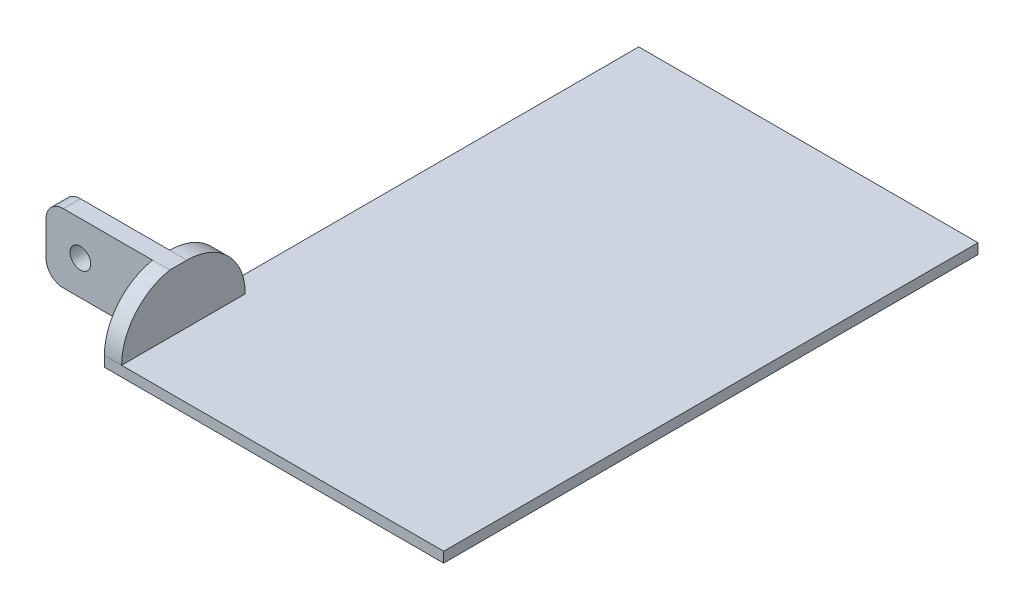
ISO-10303-21;
HEADER;
FILE_DESCRIPTION(('STEP AP214'),'2;1');
FILE_NAME('part.step','',(''),(''),'','','');
FILE_SCHEMA(('AUTOMOTIVE_DESIGN { 1 0 10303 214 1 1 1 1 }'));
ENDSEC;
DATA;
#1=APPLICATION_CONTEXT('core data for automotive mechanical design processes');
#2=APPLICATION_PROTOCOL_DEFINITION('international standard','automotive_design',2000,#1);
#3=PRODUCT_CONTEXT('',#1,'mechanical');
#4=PRODUCT('Part','Part','',(#3));
#5=PRODUCT_RELATED_PRODUCT_CATEGORY('part','',(#4));
#6=PRODUCT_DEFINITION_FORMATION('','',#4);
#7=PRODUCT_DEFINITION_CONTEXT('part definition',#1,'design');
#8=PRODUCT_DEFINITION('design','',#6,#7);
#9=PRODUCT_DEFINITION_SHAPE('','',#8);
#10=(LENGTH_UNIT() NAMED_UNIT(*) SI_UNIT(.MILLI.,.METRE.));
#11=(NAMED_UNIT(*) PLANE_ANGLE_UNIT() SI_UNIT($,.RADIAN.));
#12=(NAMED_UNIT(*) SI_UNIT($,.STERADIAN.) SOLID_ANGLE_UNIT());
#13=UNCERTAINTY_MEASURE_WITH_UNIT(LENGTH_MEASURE(1.E-05),#10,'distance_accuracy_value','');
#14=(GEOMETRIC_REPRESENTATION_CONTEXT(3) GLOBAL_UNCERTAINTY_ASSIGNED_CONTEXT((#13)) GLOBAL_UNIT_ASSIGNED_CONTEXT((#10,
#11,#12)) REPRESENTATION_CONTEXT('',''));
#15=CARTESIAN_POINT('',(0.,0.,0.));
#16=DIRECTION('',(0.,0.,1.));
#17=DIRECTION('',(1.,0.,0.));
#18=AXIS2_PLACEMENT_3D('',#15,#16,#17);
#19=CARTESIAN_POINT('',(155.55596763185,50.4019224698779,67.2635182233307));
#20=DIRECTION('',(0.,-1.,0.));
#21=DIRECTION('',(0.,0.,-1.));
#22=AXIS2_PLACEMENT_3D('',#19,#20,#21);
#23=PLANE('',#22);
#24=DIRECTION('',(0.,0.,1.));
#25=VECTOR('',#24,1.);
#26=CARTESIAN_POINT('',(-93.75,50.4019224698779,53.2635182233307));
#27=LINE('',#26,#25);
#28=CARTESIAN_POINT('',(-93.75,50.4019224698779,31.2635182233307));
#29=VERTEX_POINT('',#28);
#30=CARTESIAN_POINT('',(-93.75,50.4019224698779,67.2635182233307));
#31=VERTEX_POINT('',#30);
#32=EDGE_CURVE('E11',#29,#31,#27,.T.);
#33=ORIENTED_EDGE('',*,*,#32,.T.);
#34=DIRECTION('',(-1.,0.,0.));
#35=VECTOR('',#34,1.);
#36=CARTESIAN_POINT('',(155.55596763185,50.4019224698779,67.2635182233307));
#37=LINE('',#36,#35);
#38=CARTESIAN_POINT('',(0.,50.4019224698779,67.2635182233307));
#39=VERTEX_POINT('',#38);
#40=EDGE_CURVE('E141',#39,#31,#37,.T.);
#41=ORIENTED_EDGE('',*,*,#40,.F.);
#42=DIRECTION('',(0.,0.,1.));
#43=VECTOR('',#42,1.);
#44=CARTESIAN_POINT('',(0.,50.4019224698779,67.2635182233307));
#45=LINE('',#44,#43);
#46=CARTESIAN_POINT('',(0.,50.4019224698779,-88.2635182233307));
#47=VERTEX_POINT('',#46);
#48=EDGE_CURVE('E176',#47,#39,#45,.T.);
#49=ORIENTED_EDGE('',*,*,#48,.F.);
#50=DIRECTION('',(-1.,0.,0.));
#51=VECTOR('',#50,1.);
#52=CARTESIAN_POINT('',(155.55596763185,50.4019224698779,-88.2635182233307));
#53=LINE('',#52,#51);
#54=CARTESIAN_POINT('',(-98.75,50.4019224698779,-88.2635182233307));
#55=VERTEX_POINT('',#54);
#56=EDGE_CURVE('E179',#47,#55,#53,.T.);
#57=ORIENTED_EDGE('',*,*,#56,.T.);
#58=DIRECTION('',(0.,0.,1.));
#59=VECTOR('',#58,1.);
#60=CARTESIAN_POINT('',(-98.75,50.4019224698779,67.2635182233307));
#61=LINE('',#60,#59);
#62=CARTESIAN_POINT('',(-98.75,50.4019224698779,31.2635182233307));
#63=VERTEX_POINT('',#62);
#64=EDGE_CURVE('E164',#55,#63,#61,.T.);
#65=ORIENTED_EDGE('',*,*,#64,.T.);
#66=DIRECTION('',(1.,0.,0.));
#67=VECTOR('',#66,1.);
#68=CARTESIAN_POINT('',(-98.75,50.4019224698779,31.2635182233307));
#69=LINE('',#68,#67);
#70=EDGE_CURVE('E135',#63,#29,#69,.T.);
#71=ORIENTED_EDGE('',*,*,#70,.T.);
#72=EDGE_LOOP('',(#33,#41,#49,#57,#65,#71));
#73=FACE_BOUND('',#72,.T.);
#74=ADVANCED_FACE('F34',(#73),#23,.F.);
#75=CARTESIAN_POINT('',(-124.75,52.4019224698779,53.2635182233307));
#76=DIRECTION('',(0.,0.,1.));
#77=DIRECTION('',(1.,0.,0.));
#78=AXIS2_PLACEMENT_3D('',#75,#76,#77);
#79=PLANE('',#78);
#80=DIRECTION('',(0.,-1.,0.));
#81=VECTOR('',#80,1.);
#82=CARTESIAN_POINT('',(-98.75,52.4019224698779,53.2635182233307));
#83=LINE('',#82,#81);
#84=CARTESIAN_POINT('',(-98.75,67.4019224698779,53.2635182233307));
#85=VERTEX_POINT('',#84);
#86=CARTESIAN_POINT('',(-98.75,47.4019224698779,53.2635182233307));
#87=VERTEX_POINT('',#86);
#88=EDGE_CURVE('E49',#85,#87,#83,.T.);
#89=ORIENTED_EDGE('',*,*,#88,.F.);
#90=DIRECTION('',(-1.,0.,0.));
#91=VECTOR('',#90,1.);
#92=CARTESIAN_POINT('',(-124.75,67.4019224698779,53.2635182233307));
#93=LINE('',#92,#91);
#94=CARTESIAN_POINT('',(-124.75,67.4019224698779,53.2635182233307));
#95=VERTEX_POINT('',#94);
#96=EDGE_CURVE('E198',#85,#95,#93,.T.);
#97=ORIENTED_EDGE('',*,*,#96,.T.);
#98=CARTESIAN_POINT('',(-124.75,62.4019224698779,53.2635182233307));
#99=DIRECTION('',(0.,0.,1.));
#100=DIRECTION('',(1.,0.,0.));
#101=AXIS2_PLACEMENT_3D('',#98,#99,#100);
#102=CIRCLE('',#101,5.);
#103=CARTESIAN_POINT('',(-129.75,62.4019224698779,53.2635182233307));
#104=VERTEX_POINT('',#103);
#105=EDGE_CURVE('E197',#95,#104,#102,.T.);
#106=ORIENTED_EDGE('',*,*,#105,.T.);
#107=DIRECTION('',(0.,-1.,0.));
#108=VECTOR('',#107,1.);
#109=CARTESIAN_POINT('',(-129.75,62.4019224698779,53.2635182233307));
#110=LINE('',#109,#108);
#111=CARTESIAN_POINT('',(-129.75,52.4019224698779,53.2635182233307));
#112=VERTEX_POINT('',#111);
#113=EDGE_CURVE('E200',#104,#112,#110,.T.);
#114=ORIENTED_EDGE('',*,*,#113,.T.);
#115=CARTESIAN_POINT('',(-124.75,52.4019224698779,53.2635182233307));
#116=DIRECTION('',(0.,0.,1.));
#117=DIRECTION('',(1.,0.,0.));
#118=AXIS2_PLACEMENT_3D('',#115,#116,#117);
#119=CIRCLE('',#118,5.);
#120=CARTESIAN_POINT('',(-124.75,47.4019224698779,53.2635182233307));
#121=VERTEX_POINT('',#120);
#122=EDGE_CURVE('E202',#112,#121,#119,.T.);
#123=ORIENTED_EDGE('',*,*,#122,.T.);
#124=DIRECTION('',(1.,0.,0.));
#125=VECTOR('',#124,1.);
#126=CARTESIAN_POINT('',(-124.75,47.4019224698779,53.2635182233307));
#127=LINE('',#126,#125);
#128=EDGE_CURVE('E204',#121,#87,#127,.T.);
#129=ORIENTED_EDGE('',*,*,#128,.T.);
#130=EDGE_LOOP('',(#89,#97,#106,#114,#123,#129));
#131=FACE_BOUND('',#130,.T.);
#132=CARTESIAN_POINT('',(-119.75,57.4019224698779,53.2635182233307));
#133=DIRECTION('',(0.,0.,1.));
#134=DIRECTION('',(1.,0.,0.));
#135=AXIS2_PLACEMENT_3D('',#132,#133,#134);
#136=CIRCLE('',#135,3.00000000000001);
#137=CARTESIAN_POINT('',(-116.75,57.4019224698779,53.2635182233307));
#138=VERTEX_POINT('',#137);
#139=EDGE_CURVE('E190',#138,#138,#136,.T.);
#140=ORIENTED_EDGE('',*,*,#139,.F.);
#141=EDGE_LOOP('',(#140));
#142=FACE_BOUND('',#141,.T.);
#143=ADVANCED_FACE('F256',(#131,#142),#79,.T.);
#144=CARTESIAN_POINT('',(-124.75,52.4019224698779,48.2635182233307));
#145=DIRECTION('',(0.,0.,1.));
#146=DIRECTION('',(1.,0.,0.));
#147=AXIS2_PLACEMENT_3D('',#144,#145,#146);
#148=PLANE('',#147);
#149=CARTESIAN_POINT('',(-119.75,57.4019224698779,48.2635182233307));
#150=DIRECTION('',(0.,0.,1.));
#151=DIRECTION('',(1.,0.,0.));
#152=AXIS2_PLACEMENT_3D('',#149,#150,#151);
#153=CIRCLE('',#152,3.00000000000001);
#154=CARTESIAN_POINT('',(-116.75,57.4019224698779,48.2635182233307));
#155=VERTEX_POINT('',#154);
#156=EDGE_CURVE('E189',#155,#155,#153,.T.);
#157=ORIENTED_EDGE('',*,*,#156,.T.);
#158=EDGE_LOOP('',(#157));
#159=FACE_BOUND('',#158,.T.);
#160=DIRECTION('',(-1.,0.,0.));
#161=VECTOR('',#160,1.);
#162=CARTESIAN_POINT('',(-124.75,67.4019224698779,48.2635182233307));
#163=LINE('',#162,#161);
#164=CARTESIAN_POINT('',(-98.75,67.4019224698779,48.2635182233307));
#165=VERTEX_POINT('',#164);
#166=CARTESIAN_POINT('',(-124.75,67.4019224698779,48.2635182233307));
#167=VERTEX_POINT('',#166);
#168=EDGE_CURVE('E193',#165,#167,#163,.T.);
#169=ORIENTED_EDGE('',*,*,#168,.F.);
#170=DIRECTION('',(0.,-1.,0.));
#171=VECTOR('',#170,1.);
#172=CARTESIAN_POINT('',(-98.75,52.4019224698779,48.2635182233307));
#173=LINE('',#172,#171);
#174=CARTESIAN_POINT('',(-98.75,47.4019224698779,48.2635182233307));
#175=VERTEX_POINT('',#174);
#176=EDGE_CURVE('E169',#165,#175,#173,.T.);
#177=ORIENTED_EDGE('',*,*,#176,.T.);
#178=DIRECTION('',(1.,0.,0.));
#179=VECTOR('',#178,1.);
#180=CARTESIAN_POINT('',(-124.75,47.4019224698779,48.2635182233307));
#181=LINE('',#180,#179);
#182=CARTESIAN_POINT('',(-124.75,47.4019224698779,48.2635182233307));
#183=VERTEX_POINT('',#182);
#184=EDGE_CURVE('E216',#183,#175,#181,.T.);
#185=ORIENTED_EDGE('',*,*,#184,.F.);
#186=CARTESIAN_POINT('',(-124.75,52.4019224698779,48.2635182233307));
#187=DIRECTION('',(0.,0.,1.));
#188=DIRECTION('',(1.,0.,0.));
#189=AXIS2_PLACEMENT_3D('',#186,#187,#188);
#190=CIRCLE('',#189,5.);
#191=CARTESIAN_POINT('',(-129.75,52.4019224698779,48.2635182233307));
#192=VERTEX_POINT('',#191);
#193=EDGE_CURVE('E214',#192,#183,#190,.T.);
#194=ORIENTED_EDGE('',*,*,#193,.F.);
#195=DIRECTION('',(0.,-1.,0.));
#196=VECTOR('',#195,1.);
#197=CARTESIAN_POINT('',(-129.75,62.4019224698779,48.2635182233307));
#198=LINE('',#197,#196);
#199=CARTESIAN_POINT('',(-129.75,62.4019224698779,48.2635182233307));
#200=VERTEX_POINT('',#199);
#201=EDGE_CURVE('E212',#200,#192,#198,.T.);
#202=ORIENTED_EDGE('',*,*,#201,.F.);
#203=CARTESIAN_POINT('',(-124.75,62.4019224698779,48.2635182233307));
#204=DIRECTION('',(0.,0.,1.));
#205=DIRECTION('',(1.,0.,0.));
#206=AXIS2_PLACEMENT_3D('',#203,#204,#205);
#207=CIRCLE('',#206,5.);
#208=EDGE_CURVE('E210',#167,#200,#207,.T.);
#209=ORIENTED_EDGE('',*,*,#208,.F.);
#210=EDGE_LOOP('',(#169,#177,#185,#194,#202,#209));
#211=FACE_BOUND('',#210,.T.);
#212=ADVANCED_FACE('F248',(#159,#211),#148,.F.);
#213=CARTESIAN_POINT('',(-93.75,67.4019224698779,53.2635182233307));
#214=DIRECTION('',(-1.,0.,0.));
#215=DIRECTION('',(0.,0.,1.));
#216=AXIS2_PLACEMENT_3D('',#213,#214,#215);
#217=PLANE('',#216);
#218=ORIENTED_EDGE('',*,*,#32,.F.);
#219=CARTESIAN_POINT('',(-93.75,50.4019224698779,48.2635182233307));
#220=DIRECTION('',(1.,0.,0.));
#221=DIRECTION('',(0.,0.,1.));
#222=AXIS2_PLACEMENT_3D('',#219,#220,#221);
#223=CIRCLE('',#222,17.);
#224=CARTESIAN_POINT('',(-93.75,67.4019224698779,48.2635182233307));
#225=VERTEX_POINT('',#224);
#226=EDGE_CURVE('E145',#29,#225,#223,.T.);
#227=ORIENTED_EDGE('',*,*,#226,.T.);
#228=DIRECTION('',(0.,0.,-1.));
#229=VECTOR('',#228,1.);
#230=CARTESIAN_POINT('',(-93.75,67.4019224698779,53.2635182233307));
#231=LINE('',#230,#229);
#232=CARTESIAN_POINT('',(-93.75,67.4019224698779,53.2635182233307));
#233=VERTEX_POINT('',#232);
#234=EDGE_CURVE('E42',#233,#225,#231,.T.);
#235=ORIENTED_EDGE('',*,*,#234,.F.);
#236=CARTESIAN_POINT('',(-93.75,50.4019224698779,49.9420896519021));
#237=DIRECTION('',(1.,0.,0.));
#238=DIRECTION('',(0.,0.,1.));
#239=AXIS2_PLACEMENT_3D('',#236,#237,#238);
#240=CIRCLE('',#239,17.3214285714286);
#241=EDGE_CURVE('E150',#233,#31,#240,.T.);
#242=ORIENTED_EDGE('',*,*,#241,.T.);
#243=EDGE_LOOP('',(#218,#227,#235,#242));
#244=FACE_BOUND('',#243,.T.);
#245=ADVANCED_FACE('F36',(#244),#217,.F.);
#246=CARTESIAN_POINT('',(-124.75,67.4019224698779,53.2635182233307));
#247=DIRECTION('',(0.,-1.,0.));
#248=DIRECTION('',(0.,0.,-1.));
#249=AXIS2_PLACEMENT_3D('',#246,#247,#248);
#250=PLANE('',#249);
#251=EDGE_CURVE('E207',#225,#165,#163,.T.);
#252=ORIENTED_EDGE('',*,*,#251,.T.);
#253=ORIENTED_EDGE('',*,*,#168,.T.);
#254=DIRECTION('',(0.,0.,-1.));
#255=VECTOR('',#254,1.);
#256=CARTESIAN_POINT('',(-124.75,67.4019224698779,53.2635182233307));
#257=LINE('',#256,#255);
#258=EDGE_CURVE('E227',#95,#167,#257,.T.);
#259=ORIENTED_EDGE('',*,*,#258,.F.);
#260=ORIENTED_EDGE('',*,*,#96,.F.);
#261=EDGE_CURVE('E149',#233,#85,#93,.T.);
#262=ORIENTED_EDGE('',*,*,#261,.F.);
#263=ORIENTED_EDGE('',*,*,#234,.T.);
#264=EDGE_LOOP('',(#252,#253,#259,#260,#262,#263));
#265=FACE_BOUND('',#264,.T.);
#266=ADVANCED_FACE('F232',(#265),#250,.F.);
#267=CARTESIAN_POINT('',(-124.75,62.4019224698779,53.2635182233307));
#268=DIRECTION('',(0.,0.,-1.));
#269=DIRECTION('',(-1.,0.,0.));
#270=AXIS2_PLACEMENT_3D('',#267,#268,#269);
#271=CYLINDRICAL_SURFACE('',#270,5.);
#272=ORIENTED_EDGE('',*,*,#208,.T.);
#273=DIRECTION('',(0.,0.,-1.));
#274=VECTOR('',#273,1.);
#275=CARTESIAN_POINT('',(-129.75,62.4019224698779,53.2635182233307));
#276=LINE('',#275,#274);
#277=EDGE_CURVE('E224',#104,#200,#276,.T.);
#278=ORIENTED_EDGE('',*,*,#277,.F.);
#279=ORIENTED_EDGE('',*,*,#105,.F.);
#280=ORIENTED_EDGE('',*,*,#258,.T.);
#281=EDGE_LOOP('',(#272,#278,#279,#280));
#282=FACE_BOUND('',#281,.T.);
#283=ADVANCED_FACE('F253',(#282),#271,.T.);
#284=CARTESIAN_POINT('',(-129.75,62.4019224698779,53.2635182233307));
#285=DIRECTION('',(1.,0.,0.));
#286=DIRECTION('',(0.,0.,-1.));
#287=AXIS2_PLACEMENT_3D('',#284,#285,#286);
#288=PLANE('',#287);
#289=ORIENTED_EDGE('',*,*,#201,.T.);
#290=DIRECTION('',(0.,0.,-1.));
#291=VECTOR('',#290,1.);
#292=CARTESIAN_POINT('',(-129.75,52.4019224698779,53.2635182233307));
#293=LINE('',#292,#291);
#294=EDGE_CURVE('E221',#112,#192,#293,.T.);
#295=ORIENTED_EDGE('',*,*,#294,.F.);
#296=ORIENTED_EDGE('',*,*,#113,.F.);
#297=ORIENTED_EDGE('',*,*,#277,.T.);
#298=EDGE_LOOP('',(#289,#295,#296,#297));
#299=FACE_BOUND('',#298,.T.);
#300=ADVANCED_FACE('F262',(#299),#288,.F.);
#301=CARTESIAN_POINT('',(-124.75,52.4019224698779,53.2635182233307));
#302=DIRECTION('',(0.,0.,-1.));
#303=DIRECTION('',(-1.,0.,0.));
#304=AXIS2_PLACEMENT_3D('',#301,#302,#303);
#305=CYLINDRICAL_SURFACE('',#304,5.);
#306=ORIENTED_EDGE('',*,*,#193,.T.);
#307=DIRECTION('',(0.,0.,-1.));
#308=VECTOR('',#307,1.);
#309=CARTESIAN_POINT('',(-124.75,47.4019224698779,53.2635182233307));
#310=LINE('',#309,#308);
#311=EDGE_CURVE('E206',#121,#183,#310,.T.);
#312=ORIENTED_EDGE('',*,*,#311,.F.);
#313=ORIENTED_EDGE('',*,*,#122,.F.);
#314=ORIENTED_EDGE('',*,*,#294,.T.);
#315=EDGE_LOOP('',(#306,#312,#313,#314));
#316=FACE_BOUND('',#315,.T.);
#317=ADVANCED_FACE('F265',(#316),#305,.T.);
#318=CARTESIAN_POINT('',(-124.75,47.4019224698779,53.2635182233307));
#319=DIRECTION('',(0.,1.,0.));
#320=DIRECTION('',(0.,0.,1.));
#321=AXIS2_PLACEMENT_3D('',#318,#319,#320);
#322=PLANE('',#321);
#323=ORIENTED_EDGE('',*,*,#184,.T.);
#324=DIRECTION('',(0.,0.,-1.));
#325=VECTOR('',#324,1.);
#326=CARTESIAN_POINT('',(-98.75,47.4019224698779,67.2635182233307));
#327=LINE('',#326,#325);
#328=CARTESIAN_POINT('',(-98.75,47.4019224698779,-88.2635182233307));
#329=VERTEX_POINT('',#328);
#330=EDGE_CURVE('E134',#175,#329,#327,.T.);
#331=ORIENTED_EDGE('',*,*,#330,.T.);
#332=DIRECTION('',(-1.,0.,0.));
#333=VECTOR('',#332,1.);
#334=CARTESIAN_POINT('',(155.55596763185,47.4019224698779,-88.2635182233307));
#335=LINE('',#334,#333);
#336=CARTESIAN_POINT('',(0.,47.4019224698779,-88.2635182233307));
#337=VERTEX_POINT('',#336);
#338=EDGE_CURVE('E182',#337,#329,#335,.T.);
#339=ORIENTED_EDGE('',*,*,#338,.F.);
#340=DIRECTION('',(0.,0.,-1.));
#341=VECTOR('',#340,1.);
#342=CARTESIAN_POINT('',(0.,47.4019224698779,67.2635182233307));
#343=LINE('',#342,#341);
#344=CARTESIAN_POINT('',(0.,47.4019224698779,67.2635182233307));
#345=VERTEX_POINT('',#344);
#346=EDGE_CURVE('E170',#345,#337,#343,.T.);
#347=ORIENTED_EDGE('',*,*,#346,.F.);
#348=DIRECTION('',(-1.,0.,0.));
#349=VECTOR('',#348,1.);
#350=CARTESIAN_POINT('',(155.55596763185,47.4019224698779,67.2635182233307));
#351=LINE('',#350,#349);
#352=CARTESIAN_POINT('',(-98.75,47.4019224698779,67.2635182233307));
#353=VERTEX_POINT('',#352);
#354=EDGE_CURVE('E180',#345,#353,#351,.T.);
#355=ORIENTED_EDGE('',*,*,#354,.T.);
#356=EDGE_CURVE('E131',#353,#87,#327,.T.);
#357=ORIENTED_EDGE('',*,*,#356,.T.);
#358=ORIENTED_EDGE('',*,*,#128,.F.);
#359=ORIENTED_EDGE('',*,*,#311,.T.);
#360=EDGE_LOOP('',(#323,#331,#339,#347,#355,#357,#358,#359));
#361=FACE_BOUND('',#360,.T.);
#362=ADVANCED_FACE('F268',(#361),#322,.F.);
#363=CARTESIAN_POINT('',(-119.75,57.4019224698779,53.2635182233307));
#364=DIRECTION('',(0.,0.,-1.));
#365=DIRECTION('',(-1.,0.,0.));
#366=AXIS2_PLACEMENT_3D('',#363,#364,#365);
#367=CYLINDRICAL_SURFACE('',#366,3.00000000000001);
#368=ORIENTED_EDGE('',*,*,#139,.T.);
#369=EDGE_LOOP('',(#368));
#370=FACE_BOUND('',#369,.T.);
#371=ORIENTED_EDGE('',*,*,#156,.F.);
#372=EDGE_LOOP('',(#371));
#373=FACE_BOUND('',#372,.T.);
#374=ADVANCED_FACE('F359',(#370,#373),#367,.F.);
#375=CARTESIAN_POINT('',(-98.75,0.,0.));
#376=DIRECTION('',(-1.,0.,0.));
#377=DIRECTION('',(0.,0.,1.));
#378=AXIS2_PLACEMENT_3D('',#375,#376,#377);
#379=PLANE('',#378);
#380=ORIENTED_EDGE('',*,*,#176,.F.);
#381=CARTESIAN_POINT('',(-98.75,50.4019224698779,48.2635182233307));
#382=DIRECTION('',(1.,0.,0.));
#383=DIRECTION('',(0.,0.,1.));
#384=AXIS2_PLACEMENT_3D('',#381,#382,#383);
#385=CIRCLE('',#384,17.);
#386=EDGE_CURVE('E154',#63,#165,#385,.T.);
#387=ORIENTED_EDGE('',*,*,#386,.F.);
#388=ORIENTED_EDGE('',*,*,#64,.F.);
#389=DIRECTION('',(0.,1.,0.));
#390=VECTOR('',#389,1.);
#391=CARTESIAN_POINT('',(-98.75,47.4019224698779,-88.2635182233307));
#392=LINE('',#391,#390);
#393=EDGE_CURVE('E161',#329,#55,#392,.T.);
#394=ORIENTED_EDGE('',*,*,#393,.F.);
#395=ORIENTED_EDGE('',*,*,#330,.F.);
#396=EDGE_LOOP('',(#380,#387,#388,#394,#395));
#397=FACE_BOUND('',#396,.T.);
#398=ADVANCED_FACE('F241',(#397),#379,.T.);
#399=CARTESIAN_POINT('',(155.55596763185,47.4019224698779,67.2635182233307));
#400=DIRECTION('',(0.,0.,-1.));
#401=DIRECTION('',(-1.,0.,0.));
#402=AXIS2_PLACEMENT_3D('',#399,#400,#401);
#403=PLANE('',#402);
#404=DIRECTION('',(0.,-1.,0.));
#405=VECTOR('',#404,1.);
#406=CARTESIAN_POINT('',(0.,47.4019224698779,67.2635182233307));
#407=LINE('',#406,#405);
#408=EDGE_CURVE('E173',#39,#345,#407,.T.);
#409=ORIENTED_EDGE('',*,*,#408,.F.);
#410=ORIENTED_EDGE('',*,*,#40,.T.);
#411=DIRECTION('',(1.,0.,0.));
#412=VECTOR('',#411,1.);
#413=CARTESIAN_POINT('',(-98.75,50.4019224698779,67.2635182233307));
#414=LINE('',#413,#412);
#415=CARTESIAN_POINT('',(-98.75,50.4019224698779,67.2635182233307));
#416=VERTEX_POINT('',#415);
#417=EDGE_CURVE('E138',#416,#31,#414,.T.);
#418=ORIENTED_EDGE('',*,*,#417,.F.);
#419=DIRECTION('',(0.,-1.,0.));
#420=VECTOR('',#419,1.);
#421=CARTESIAN_POINT('',(-98.75,47.4019224698779,67.2635182233307));
#422=LINE('',#421,#420);
#423=EDGE_CURVE('E125',#416,#353,#422,.T.);
#424=ORIENTED_EDGE('',*,*,#423,.T.);
#425=ORIENTED_EDGE('',*,*,#354,.F.);
#426=EDGE_LOOP('',(#409,#410,#418,#424,#425));
#427=FACE_BOUND('',#426,.T.);
#428=ADVANCED_FACE('F140',(#427),#403,.F.);
#429=CARTESIAN_POINT('',(155.55596763185,47.4019224698779,-88.2635182233307));
#430=DIRECTION('',(0.,0.,1.));
#431=DIRECTION('',(1.,0.,0.));
#432=AXIS2_PLACEMENT_3D('',#429,#430,#431);
#433=PLANE('',#432);
#434=DIRECTION('',(0.,1.,0.));
#435=VECTOR('',#434,1.);
#436=CARTESIAN_POINT('',(0.,47.4019224698779,-88.2635182233307));
#437=LINE('',#436,#435);
#438=EDGE_CURVE('E166',#337,#47,#437,.T.);
#439=ORIENTED_EDGE('',*,*,#438,.F.);
#440=ORIENTED_EDGE('',*,*,#338,.T.);
#441=ORIENTED_EDGE('',*,*,#393,.T.);
#442=ORIENTED_EDGE('',*,*,#56,.F.);
#443=EDGE_LOOP('',(#439,#440,#441,#442));
#444=FACE_BOUND('',#443,.T.);
#445=ADVANCED_FACE('F274',(#444),#433,.F.);
#446=CARTESIAN_POINT('',(0.,0.,0.));
#447=DIRECTION('',(1.,0.,0.));
#448=DIRECTION('',(0.,0.,-1.));
#449=AXIS2_PLACEMENT_3D('',#446,#447,#448);
#450=PLANE('',#449);
#451=ORIENTED_EDGE('',*,*,#48,.T.);
#452=ORIENTED_EDGE('',*,*,#408,.T.);
#453=ORIENTED_EDGE('',*,*,#346,.T.);
#454=ORIENTED_EDGE('',*,*,#438,.T.);
#455=EDGE_LOOP('',(#451,#452,#453,#454));
#456=FACE_BOUND('',#455,.T.);
#457=ADVANCED_FACE('F271',(#456),#450,.T.);
#458=ORIENTED_EDGE('',*,*,#423,.F.);
#459=CARTESIAN_POINT('',(-98.75,50.4019224698779,49.9420896519021));
#460=DIRECTION('',(1.,0.,0.));
#461=DIRECTION('',(0.,0.,1.));
#462=AXIS2_PLACEMENT_3D('',#459,#460,#461);
#463=CIRCLE('',#462,17.3214285714286);
#464=EDGE_CURVE('E129',#85,#416,#463,.T.);
#465=ORIENTED_EDGE('',*,*,#464,.F.);
#466=ORIENTED_EDGE('',*,*,#88,.T.);
#467=ORIENTED_EDGE('',*,*,#356,.F.);
#468=EDGE_LOOP('',(#458,#465,#466,#467));
#469=FACE_BOUND('',#468,.T.);
#470=ADVANCED_FACE('F127',(#469),#379,.T.);
#471=CARTESIAN_POINT('',(-98.75,50.4019224698779,48.2635182233307));
#472=DIRECTION('',(1.,0.,0.));
#473=DIRECTION('',(0.,0.,-1.));
#474=AXIS2_PLACEMENT_3D('',#471,#472,#473);
#475=CYLINDRICAL_SURFACE('',#474,17.);
#476=ORIENTED_EDGE('',*,*,#226,.F.);
#477=ORIENTED_EDGE('',*,*,#70,.F.);
#478=ORIENTED_EDGE('',*,*,#386,.T.);
#479=ORIENTED_EDGE('',*,*,#251,.F.);
#480=EDGE_LOOP('',(#476,#477,#478,#479));
#481=FACE_BOUND('',#480,.T.);
#482=ADVANCED_FACE('F236',(#481),#475,.T.);
#483=CARTESIAN_POINT('',(-98.75,50.4019224698779,49.9420896519021));
#484=DIRECTION('',(1.,0.,0.));
#485=DIRECTION('',(0.,0.,-1.));
#486=AXIS2_PLACEMENT_3D('',#483,#484,#485);
#487=CYLINDRICAL_SURFACE('',#486,17.3214285714286);
#488=ORIENTED_EDGE('',*,*,#241,.F.);
#489=ORIENTED_EDGE('',*,*,#261,.T.);
#490=ORIENTED_EDGE('',*,*,#464,.T.);
#491=ORIENTED_EDGE('',*,*,#417,.T.);
#492=EDGE_LOOP('',(#488,#489,#490,#491));
#493=FACE_BOUND('',#492,.T.);
#494=ADVANCED_FACE('F148',(#493),#487,.T.);
#495=CLOSED_SHELL('',(#74,#143,#212,#245,#266,#283,#300,#317,#362,#374,#398,#428,#445,#457,#470,
#482,#494));
#496=MANIFOLD_SOLID_BREP('B2',#495);
#497=ADVANCED_BREP_SHAPE_REPRESENTATION('',(#18,#496),#14);
#498=SHAPE_DEFINITION_REPRESENTATION(#9,#497);
ENDSEC;
END-ISO-10303-21;
